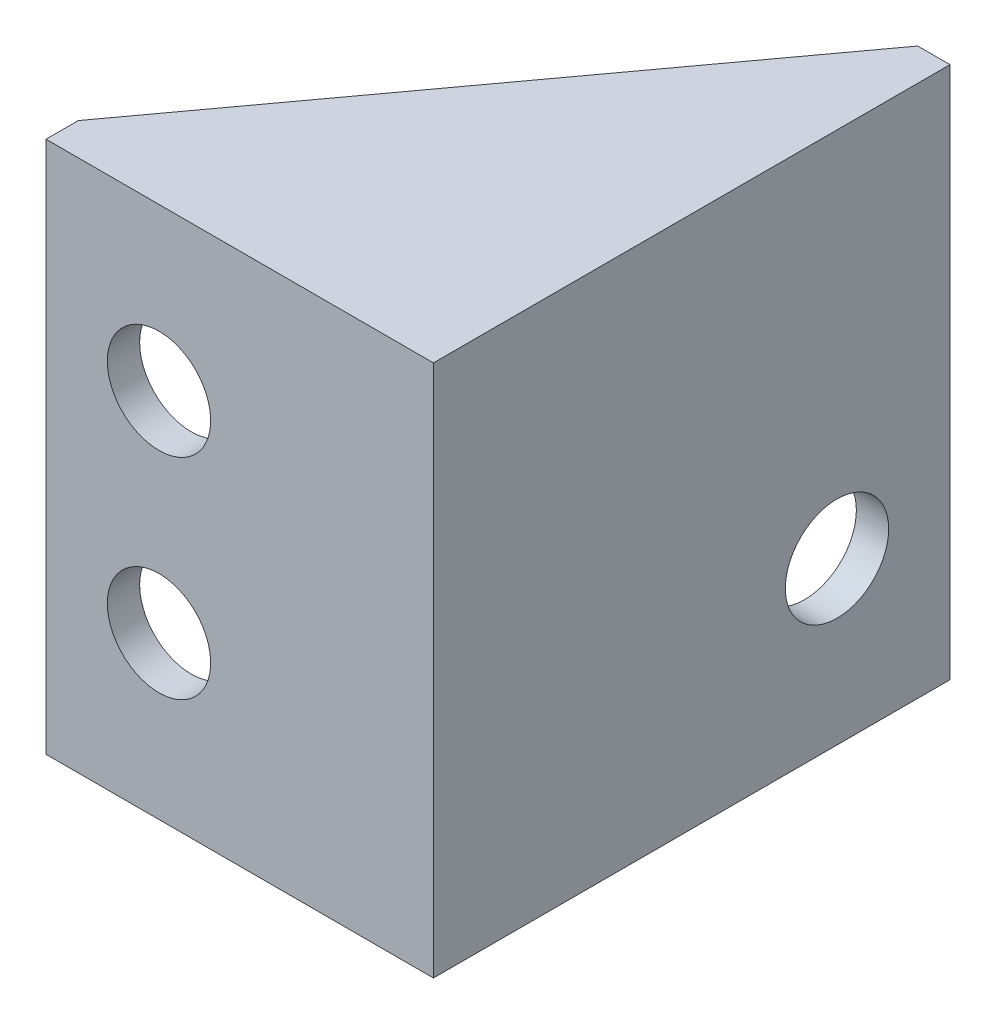
ISO-10303-21;
HEADER;
FILE_DESCRIPTION(('STEP AP214'),'2;1');
FILE_NAME('part.step','',(''),(''),'','','');
FILE_SCHEMA(('AUTOMOTIVE_DESIGN { 1 0 10303 214 1 1 1 1 }'));
ENDSEC;
DATA;
#1=APPLICATION_CONTEXT('core data for automotive mechanical design processes');
#2=APPLICATION_PROTOCOL_DEFINITION('international standard','automotive_design',2000,#1);
#3=PRODUCT_CONTEXT('',#1,'mechanical');
#4=PRODUCT('Part','Part','',(#3));
#5=PRODUCT_RELATED_PRODUCT_CATEGORY('part','',(#4));
#6=PRODUCT_DEFINITION_FORMATION('','',#4);
#7=PRODUCT_DEFINITION_CONTEXT('part definition',#1,'design');
#8=PRODUCT_DEFINITION('design','',#6,#7);
#9=PRODUCT_DEFINITION_SHAPE('','',#8);
#10=(LENGTH_UNIT() NAMED_UNIT(*) SI_UNIT(.MILLI.,.METRE.));
#11=(NAMED_UNIT(*) PLANE_ANGLE_UNIT() SI_UNIT($,.RADIAN.));
#12=(NAMED_UNIT(*) SI_UNIT($,.STERADIAN.) SOLID_ANGLE_UNIT());
#13=UNCERTAINTY_MEASURE_WITH_UNIT(LENGTH_MEASURE(1.E-05),#10,'distance_accuracy_value','');
#14=(GEOMETRIC_REPRESENTATION_CONTEXT(3) GLOBAL_UNCERTAINTY_ASSIGNED_CONTEXT((#13)) GLOBAL_UNIT_ASSIGNED_CONTEXT((#10,
#11,#12)) REPRESENTATION_CONTEXT('',''));
#15=CARTESIAN_POINT('',(0.,0.,0.));
#16=DIRECTION('',(0.,0.,1.));
#17=DIRECTION('',(1.,0.,0.));
#18=AXIS2_PLACEMENT_3D('',#15,#16,#17);
#19=CARTESIAN_POINT('',(11.,16.5,-16.));
#20=DIRECTION('',(1.,0.,0.));
#21=DIRECTION('',(0.,0.,-1.));
#22=AXIS2_PLACEMENT_3D('',#19,#20,#21);
#23=PLANE('',#22);
#24=CARTESIAN_POINT('',(11.,5.,-12.5));
#25=DIRECTION('',(1.,0.,0.));
#26=DIRECTION('',(0.,0.,-1.));
#27=AXIS2_PLACEMENT_3D('',#24,#25,#26);
#28=CIRCLE('',#27,1.6);
#29=CARTESIAN_POINT('',(11.,5.,-14.1));
#30=VERTEX_POINT('',#29);
#31=EDGE_CURVE('E44',#30,#30,#28,.T.);
#32=ORIENTED_EDGE('',*,*,#31,.T.);
#33=EDGE_LOOP('',(#32));
#34=FACE_BOUND('',#33,.T.);
#35=DIRECTION('',(0.,0.,-1.));
#36=VECTOR('',#35,1.);
#37=CARTESIAN_POINT('',(11.,15.5,-1.));
#38=LINE('',#37,#36);
#39=CARTESIAN_POINT('',(11.,15.5,-1.));
#40=VERTEX_POINT('',#39);
#41=CARTESIAN_POINT('',(11.,15.5,-16.));
#42=VERTEX_POINT('',#41);
#43=EDGE_CURVE('E113',#40,#42,#38,.T.);
#44=ORIENTED_EDGE('',*,*,#43,.T.);
#45=DIRECTION('',(0.,-1.,0.));
#46=VECTOR('',#45,1.);
#47=CARTESIAN_POINT('',(11.,16.5,-16.));
#48=LINE('',#47,#46);
#49=CARTESIAN_POINT('',(11.,1.,-16.));
#50=VERTEX_POINT('',#49);
#51=EDGE_CURVE('E57',#42,#50,#48,.T.);
#52=ORIENTED_EDGE('',*,*,#51,.T.);
#53=DIRECTION('',(0.,0.,1.));
#54=VECTOR('',#53,1.);
#55=CARTESIAN_POINT('',(11.,1.,-1.));
#56=LINE('',#55,#54);
#57=CARTESIAN_POINT('',(11.,1.,-1.));
#58=VERTEX_POINT('',#57);
#59=EDGE_CURVE('E225',#50,#58,#56,.T.);
#60=ORIENTED_EDGE('',*,*,#59,.T.);
#61=DIRECTION('',(0.,-1.,0.));
#62=VECTOR('',#61,1.);
#63=CARTESIAN_POINT('',(11.,16.5,-1.));
#64=LINE('',#63,#62);
#65=EDGE_CURVE('E65',#40,#58,#64,.T.);
#66=ORIENTED_EDGE('',*,*,#65,.F.);
#67=EDGE_LOOP('',(#44,#52,#60,#66));
#68=FACE_BOUND('',#67,.T.);
#69=ADVANCED_FACE('F40',(#34,#68),#23,.F.);
#70=CARTESIAN_POINT('',(11.,16.5,-1.));
#71=DIRECTION('',(0.,0.,1.));
#72=DIRECTION('',(1.,0.,0.));
#73=AXIS2_PLACEMENT_3D('',#70,#71,#72);
#74=PLANE('',#73);
#75=CARTESIAN_POINT('',(3.5,11.5,-1.));
#76=DIRECTION('',(0.,0.,-1.));
#77=DIRECTION('',(-1.,0.,0.));
#78=AXIS2_PLACEMENT_3D('',#75,#76,#77);
#79=CIRCLE('',#78,1.6);
#80=CARTESIAN_POINT('',(1.9,11.5,-1.));
#81=VERTEX_POINT('',#80);
#82=EDGE_CURVE('E205',#81,#81,#79,.T.);
#83=ORIENTED_EDGE('',*,*,#82,.F.);
#84=EDGE_LOOP('',(#83));
#85=FACE_BOUND('',#84,.T.);
#86=CARTESIAN_POINT('',(3.5,5.,-1.));
#87=DIRECTION('',(0.,0.,-1.));
#88=DIRECTION('',(-1.,0.,0.));
#89=AXIS2_PLACEMENT_3D('',#86,#87,#88);
#90=CIRCLE('',#89,1.6);
#91=CARTESIAN_POINT('',(1.9,5.,-1.));
#92=VERTEX_POINT('',#91);
#93=EDGE_CURVE('E204',#92,#92,#90,.T.);
#94=ORIENTED_EDGE('',*,*,#93,.F.);
#95=EDGE_LOOP('',(#94));
#96=FACE_BOUND('',#95,.T.);
#97=DIRECTION('',(1.,0.,0.));
#98=VECTOR('',#97,1.);
#99=CARTESIAN_POINT('',(0.,15.5,-1.));
#100=LINE('',#99,#98);
#101=CARTESIAN_POINT('',(0.,15.5,-1.));
#102=VERTEX_POINT('',#101);
#103=EDGE_CURVE('E109',#102,#40,#100,.T.);
#104=ORIENTED_EDGE('',*,*,#103,.T.);
#105=ORIENTED_EDGE('',*,*,#65,.T.);
#106=DIRECTION('',(-1.,0.,0.));
#107=VECTOR('',#106,1.);
#108=CARTESIAN_POINT('',(0.,1.,-1.));
#109=LINE('',#108,#107);
#110=CARTESIAN_POINT('',(0.,1.,-1.));
#111=VERTEX_POINT('',#110);
#112=EDGE_CURVE('E131',#58,#111,#109,.T.);
#113=ORIENTED_EDGE('',*,*,#112,.T.);
#114=DIRECTION('',(0.,-1.,0.));
#115=VECTOR('',#114,1.);
#116=CARTESIAN_POINT('',(0.,16.5,-1.));
#117=LINE('',#116,#115);
#118=EDGE_CURVE('E128',#102,#111,#117,.T.);
#119=ORIENTED_EDGE('',*,*,#118,.F.);
#120=EDGE_LOOP('',(#104,#105,#113,#119));
#121=FACE_BOUND('',#120,.T.);
#122=ADVANCED_FACE('F129',(#85,#96,#121),#74,.F.);
#123=CARTESIAN_POINT('',(0.,16.5,-1.));
#124=DIRECTION('',(1.,0.,0.));
#125=DIRECTION('',(0.,0.,-1.));
#126=AXIS2_PLACEMENT_3D('',#123,#124,#125);
#127=PLANE('',#126);
#128=DIRECTION('',(0.,0.,1.));
#129=VECTOR('',#128,1.);
#130=CARTESIAN_POINT('',(0.,0.,-1.));
#131=LINE('',#130,#129);
#132=CARTESIAN_POINT('',(0.,0.,-1.));
#133=VERTEX_POINT('',#132);
#134=CARTESIAN_POINT('',(0.,0.,0.));
#135=VERTEX_POINT('',#134);
#136=EDGE_CURVE('E177',#133,#135,#131,.T.);
#137=ORIENTED_EDGE('',*,*,#136,.T.);
#138=DIRECTION('',(0.,-1.,0.));
#139=VECTOR('',#138,1.);
#140=CARTESIAN_POINT('',(0.,16.5,0.));
#141=LINE('',#140,#139);
#142=CARTESIAN_POINT('',(0.,16.5,0.));
#143=VERTEX_POINT('',#142);
#144=EDGE_CURVE('E11',#143,#135,#141,.T.);
#145=ORIENTED_EDGE('',*,*,#144,.F.);
#146=DIRECTION('',(0.,0.,1.));
#147=VECTOR('',#146,1.);
#148=CARTESIAN_POINT('',(0.,16.5,-1.));
#149=LINE('',#148,#147);
#150=CARTESIAN_POINT('',(0.,16.5,-1.));
#151=VERTEX_POINT('',#150);
#152=EDGE_CURVE('E140',#151,#143,#149,.T.);
#153=ORIENTED_EDGE('',*,*,#152,.F.);
#154=EDGE_CURVE('E121',#151,#102,#117,.T.);
#155=ORIENTED_EDGE('',*,*,#154,.T.);
#156=ORIENTED_EDGE('',*,*,#118,.T.);
#157=DIRECTION('',(0.,-1.,0.));
#158=VECTOR('',#157,1.);
#159=CARTESIAN_POINT('',(0.,1.,-1.));
#160=LINE('',#159,#158);
#161=EDGE_CURVE('E209',#111,#133,#160,.T.);
#162=ORIENTED_EDGE('',*,*,#161,.T.);
#163=EDGE_LOOP('',(#137,#145,#153,#155,#156,#162));
#164=FACE_BOUND('',#163,.T.);
#165=ADVANCED_FACE('F42',(#164),#127,.F.);
#166=CARTESIAN_POINT('',(0.,16.5,0.));
#167=DIRECTION('',(0.,0.,-1.));
#168=DIRECTION('',(-1.,0.,0.));
#169=AXIS2_PLACEMENT_3D('',#166,#167,#168);
#170=PLANE('',#169);
#171=CARTESIAN_POINT('',(3.5,5.,0.));
#172=DIRECTION('',(0.,0.,-1.));
#173=DIRECTION('',(-1.,0.,0.));
#174=AXIS2_PLACEMENT_3D('',#171,#172,#173);
#175=CIRCLE('',#174,1.6);
#176=CARTESIAN_POINT('',(1.9,5.,0.));
#177=VERTEX_POINT('',#176);
#178=EDGE_CURVE('E196',#177,#177,#175,.T.);
#179=ORIENTED_EDGE('',*,*,#178,.T.);
#180=EDGE_LOOP('',(#179));
#181=FACE_BOUND('',#180,.T.);
#182=CARTESIAN_POINT('',(3.5,11.5,0.));
#183=DIRECTION('',(0.,0.,-1.));
#184=DIRECTION('',(-1.,0.,0.));
#185=AXIS2_PLACEMENT_3D('',#182,#183,#184);
#186=CIRCLE('',#185,1.6);
#187=CARTESIAN_POINT('',(1.9,11.5,0.));
#188=VERTEX_POINT('',#187);
#189=EDGE_CURVE('E200',#188,#188,#186,.T.);
#190=ORIENTED_EDGE('',*,*,#189,.T.);
#191=EDGE_LOOP('',(#190));
#192=FACE_BOUND('',#191,.T.);
#193=DIRECTION('',(1.,0.,0.));
#194=VECTOR('',#193,1.);
#195=CARTESIAN_POINT('',(0.,0.,0.));
#196=LINE('',#195,#194);
#197=CARTESIAN_POINT('',(12.,0.,0.));
#198=VERTEX_POINT('',#197);
#199=EDGE_CURVE('E171',#135,#198,#196,.T.);
#200=ORIENTED_EDGE('',*,*,#199,.T.);
#201=DIRECTION('',(0.,-1.,0.));
#202=VECTOR('',#201,1.);
#203=CARTESIAN_POINT('',(12.,16.5,0.));
#204=LINE('',#203,#202);
#205=CARTESIAN_POINT('',(12.,16.5,0.));
#206=VERTEX_POINT('',#205);
#207=EDGE_CURVE('E50',#206,#198,#204,.T.);
#208=ORIENTED_EDGE('',*,*,#207,.F.);
#209=DIRECTION('',(1.,0.,0.));
#210=VECTOR('',#209,1.);
#211=CARTESIAN_POINT('',(0.,16.5,0.));
#212=LINE('',#211,#210);
#213=EDGE_CURVE('E187',#143,#206,#212,.T.);
#214=ORIENTED_EDGE('',*,*,#213,.F.);
#215=ORIENTED_EDGE('',*,*,#144,.T.);
#216=EDGE_LOOP('',(#200,#208,#214,#215));
#217=FACE_BOUND('',#216,.T.);
#218=ADVANCED_FACE('F250',(#181,#192,#217),#170,.F.);
#219=CARTESIAN_POINT('',(12.,16.5,0.));
#220=DIRECTION('',(-1.,0.,0.));
#221=DIRECTION('',(0.,0.,1.));
#222=AXIS2_PLACEMENT_3D('',#219,#220,#221);
#223=PLANE('',#222);
#224=CARTESIAN_POINT('',(12.,5.,-12.5));
#225=DIRECTION('',(1.,0.,0.));
#226=DIRECTION('',(0.,0.,-1.));
#227=AXIS2_PLACEMENT_3D('',#224,#225,#226);
#228=CIRCLE('',#227,1.6);
#229=CARTESIAN_POINT('',(12.,5.,-14.1));
#230=VERTEX_POINT('',#229);
#231=EDGE_CURVE('E192',#230,#230,#228,.T.);
#232=ORIENTED_EDGE('',*,*,#231,.F.);
#233=EDGE_LOOP('',(#232));
#234=FACE_BOUND('',#233,.T.);
#235=DIRECTION('',(0.,0.,-1.));
#236=VECTOR('',#235,1.);
#237=CARTESIAN_POINT('',(12.,0.,0.));
#238=LINE('',#237,#236);
#239=CARTESIAN_POINT('',(12.,0.,-16.));
#240=VERTEX_POINT('',#239);
#241=EDGE_CURVE('E164',#198,#240,#238,.T.);
#242=ORIENTED_EDGE('',*,*,#241,.T.);
#243=DIRECTION('',(0.,-1.,0.));
#244=VECTOR('',#243,1.);
#245=CARTESIAN_POINT('',(12.,16.5,-16.));
#246=LINE('',#245,#244);
#247=CARTESIAN_POINT('',(12.,16.5,-16.));
#248=VERTEX_POINT('',#247);
#249=EDGE_CURVE('E151',#248,#240,#246,.T.);
#250=ORIENTED_EDGE('',*,*,#249,.F.);
#251=DIRECTION('',(0.,0.,-1.));
#252=VECTOR('',#251,1.);
#253=CARTESIAN_POINT('',(12.,16.5,0.));
#254=LINE('',#253,#252);
#255=EDGE_CURVE('E165',#206,#248,#254,.T.);
#256=ORIENTED_EDGE('',*,*,#255,.F.);
#257=ORIENTED_EDGE('',*,*,#207,.T.);
#258=EDGE_LOOP('',(#242,#250,#256,#257));
#259=FACE_BOUND('',#258,.T.);
#260=ADVANCED_FACE('F162',(#234,#259),#223,.F.);
#261=CARTESIAN_POINT('',(12.,16.5,-16.));
#262=DIRECTION('',(0.,0.,1.));
#263=DIRECTION('',(1.,0.,0.));
#264=AXIS2_PLACEMENT_3D('',#261,#262,#263);
#265=PLANE('',#264);
#266=DIRECTION('',(-1.,0.,0.));
#267=VECTOR('',#266,1.);
#268=CARTESIAN_POINT('',(12.,0.,-16.));
#269=LINE('',#268,#267);
#270=CARTESIAN_POINT('',(11.,0.,-16.));
#271=VERTEX_POINT('',#270);
#272=EDGE_CURVE('E146',#240,#271,#269,.T.);
#273=ORIENTED_EDGE('',*,*,#272,.T.);
#274=DIRECTION('',(0.,-1.,0.));
#275=VECTOR('',#274,1.);
#276=CARTESIAN_POINT('',(11.,1.,-16.));
#277=LINE('',#276,#275);
#278=EDGE_CURVE('E213',#50,#271,#277,.T.);
#279=ORIENTED_EDGE('',*,*,#278,.F.);
#280=ORIENTED_EDGE('',*,*,#51,.F.);
#281=CARTESIAN_POINT('',(11.,16.5,-16.));
#282=VERTEX_POINT('',#281);
#283=EDGE_CURVE('E124',#282,#42,#48,.T.);
#284=ORIENTED_EDGE('',*,*,#283,.F.);
#285=DIRECTION('',(-1.,0.,0.));
#286=VECTOR('',#285,1.);
#287=CARTESIAN_POINT('',(12.,16.5,-16.));
#288=LINE('',#287,#286);
#289=EDGE_CURVE('E135',#248,#282,#288,.T.);
#290=ORIENTED_EDGE('',*,*,#289,.F.);
#291=ORIENTED_EDGE('',*,*,#249,.T.);
#292=EDGE_LOOP('',(#273,#279,#280,#284,#290,#291));
#293=FACE_BOUND('',#292,.T.);
#294=ADVANCED_FACE('F236',(#293),#265,.F.);
#295=CARTESIAN_POINT('',(0.,16.5,0.));
#296=DIRECTION('',(0.,1.,0.));
#297=DIRECTION('',(0.,0.,1.));
#298=AXIS2_PLACEMENT_3D('',#295,#296,#297);
#299=PLANE('',#298);
#300=ORIENTED_EDGE('',*,*,#152,.T.);
#301=ORIENTED_EDGE('',*,*,#213,.T.);
#302=ORIENTED_EDGE('',*,*,#255,.T.);
#303=ORIENTED_EDGE('',*,*,#289,.T.);
#304=DIRECTION('',(-0.591363663627517,0.,0.806404995855706));
#305=VECTOR('',#304,1.);
#306=CARTESIAN_POINT('',(11.,16.5,-16.));
#307=LINE('',#306,#305);
#308=EDGE_CURVE('E126',#282,#151,#307,.T.);
#309=ORIENTED_EDGE('',*,*,#308,.T.);
#310=EDGE_LOOP('',(#300,#301,#302,#303,#309));
#311=FACE_BOUND('',#310,.T.);
#312=ADVANCED_FACE('F252',(#311),#299,.T.);
#313=CARTESIAN_POINT('',(0.,0.,0.));
#314=DIRECTION('',(0.,1.,0.));
#315=DIRECTION('',(0.,0.,1.));
#316=AXIS2_PLACEMENT_3D('',#313,#314,#315);
#317=PLANE('',#316);
#318=ORIENTED_EDGE('',*,*,#136,.F.);
#319=DIRECTION('',(0.591363663627517,0.,-0.806404995855706));
#320=VECTOR('',#319,1.);
#321=CARTESIAN_POINT('',(11.,0.,-16.));
#322=LINE('',#321,#320);
#323=EDGE_CURVE('E219',#133,#271,#322,.T.);
#324=ORIENTED_EDGE('',*,*,#323,.T.);
#325=ORIENTED_EDGE('',*,*,#272,.F.);
#326=ORIENTED_EDGE('',*,*,#241,.F.);
#327=ORIENTED_EDGE('',*,*,#199,.F.);
#328=EDGE_LOOP('',(#318,#324,#325,#326,#327));
#329=FACE_BOUND('',#328,.T.);
#330=ADVANCED_FACE('F170',(#329),#317,.F.);
#331=CARTESIAN_POINT('',(6.,5.,-12.5));
#332=DIRECTION('',(1.,0.,0.));
#333=DIRECTION('',(0.,0.,-1.));
#334=AXIS2_PLACEMENT_3D('',#331,#332,#333);
#335=CYLINDRICAL_SURFACE('',#334,1.6);
#336=ORIENTED_EDGE('',*,*,#231,.T.);
#337=EDGE_LOOP('',(#336));
#338=FACE_BOUND('',#337,.T.);
#339=ORIENTED_EDGE('',*,*,#31,.F.);
#340=EDGE_LOOP('',(#339));
#341=FACE_BOUND('',#340,.T.);
#342=ADVANCED_FACE('F259',(#338,#341),#335,.F.);
#343=CARTESIAN_POINT('',(3.5,11.5,9.));
#344=DIRECTION('',(0.,0.,-1.));
#345=DIRECTION('',(-1.,0.,0.));
#346=AXIS2_PLACEMENT_3D('',#343,#344,#345);
#347=CYLINDRICAL_SURFACE('',#346,1.6);
#348=ORIENTED_EDGE('',*,*,#82,.T.);
#349=EDGE_LOOP('',(#348));
#350=FACE_BOUND('',#349,.T.);
#351=ORIENTED_EDGE('',*,*,#189,.F.);
#352=EDGE_LOOP('',(#351));
#353=FACE_BOUND('',#352,.T.);
#354=ADVANCED_FACE('F284',(#350,#353),#347,.F.);
#355=CARTESIAN_POINT('',(3.5,5.,9.));
#356=DIRECTION('',(0.,0.,-1.));
#357=DIRECTION('',(-1.,0.,0.));
#358=AXIS2_PLACEMENT_3D('',#355,#356,#357);
#359=CYLINDRICAL_SURFACE('',#358,1.6);
#360=ORIENTED_EDGE('',*,*,#93,.T.);
#361=EDGE_LOOP('',(#360));
#362=FACE_BOUND('',#361,.T.);
#363=ORIENTED_EDGE('',*,*,#178,.F.);
#364=EDGE_LOOP('',(#363));
#365=FACE_BOUND('',#364,.T.);
#366=ADVANCED_FACE('F286',(#362,#365),#359,.F.);
#367=CARTESIAN_POINT('',(11.,1.,-16.));
#368=DIRECTION('',(-0.806404995855706,0.,-0.591363663627517));
#369=DIRECTION('',(-0.591363663627517,0.,0.806404995855706));
#370=AXIS2_PLACEMENT_3D('',#367,#368,#369);
#371=PLANE('',#370);
#372=ORIENTED_EDGE('',*,*,#323,.F.);
#373=ORIENTED_EDGE('',*,*,#161,.F.);
#374=DIRECTION('',(0.591363663627517,0.,-0.806404995855706));
#375=VECTOR('',#374,1.);
#376=CARTESIAN_POINT('',(11.,1.,-16.));
#377=LINE('',#376,#375);
#378=EDGE_CURVE('E222',#111,#50,#377,.T.);
#379=ORIENTED_EDGE('',*,*,#378,.T.);
#380=ORIENTED_EDGE('',*,*,#278,.T.);
#381=EDGE_LOOP('',(#372,#373,#379,#380));
#382=FACE_BOUND('',#381,.T.);
#383=ADVANCED_FACE('F249',(#382),#371,.T.);
#384=CARTESIAN_POINT('',(0.,1.,0.));
#385=DIRECTION('',(0.,1.,0.));
#386=DIRECTION('',(0.,0.,1.));
#387=AXIS2_PLACEMENT_3D('',#384,#385,#386);
#388=PLANE('',#387);
#389=ORIENTED_EDGE('',*,*,#378,.F.);
#390=ORIENTED_EDGE('',*,*,#112,.F.);
#391=ORIENTED_EDGE('',*,*,#59,.F.);
#392=EDGE_LOOP('',(#389,#390,#391));
#393=FACE_BOUND('',#392,.T.);
#394=ADVANCED_FACE('F248',(#393),#388,.T.);
#395=CARTESIAN_POINT('',(11.,15.5,-16.));
#396=DIRECTION('',(-0.806404995855706,0.,-0.591363663627517));
#397=DIRECTION('',(-0.591363663627517,0.,0.806404995855706));
#398=AXIS2_PLACEMENT_3D('',#395,#396,#397);
#399=PLANE('',#398);
#400=ORIENTED_EDGE('',*,*,#308,.F.);
#401=ORIENTED_EDGE('',*,*,#283,.T.);
#402=DIRECTION('',(-0.591363663627517,0.,0.806404995855706));
#403=VECTOR('',#402,1.);
#404=CARTESIAN_POINT('',(11.,15.5,-16.));
#405=LINE('',#404,#403);
#406=EDGE_CURVE('E112',#42,#102,#405,.T.);
#407=ORIENTED_EDGE('',*,*,#406,.T.);
#408=ORIENTED_EDGE('',*,*,#154,.F.);
#409=EDGE_LOOP('',(#400,#401,#407,#408));
#410=FACE_BOUND('',#409,.T.);
#411=ADVANCED_FACE('F119',(#410),#399,.T.);
#412=CARTESIAN_POINT('',(0.,15.5,0.));
#413=DIRECTION('',(0.,1.,0.));
#414=DIRECTION('',(0.,0.,1.));
#415=AXIS2_PLACEMENT_3D('',#412,#413,#414);
#416=PLANE('',#415);
#417=ORIENTED_EDGE('',*,*,#406,.F.);
#418=ORIENTED_EDGE('',*,*,#43,.F.);
#419=ORIENTED_EDGE('',*,*,#103,.F.);
#420=EDGE_LOOP('',(#417,#418,#419));
#421=FACE_BOUND('',#420,.T.);
#422=ADVANCED_FACE('F111',(#421),#416,.F.);
#423=CLOSED_SHELL('',(#69,#122,#165,#218,#260,#294,#312,#330,#342,#354,#366,#383,#394,#411,#422));
#424=MANIFOLD_SOLID_BREP('B2',#423);
#425=ADVANCED_BREP_SHAPE_REPRESENTATION('',(#18,#424),#14);
#426=SHAPE_DEFINITION_REPRESENTATION(#9,#425);
ENDSEC;
END-ISO-10303-21;
